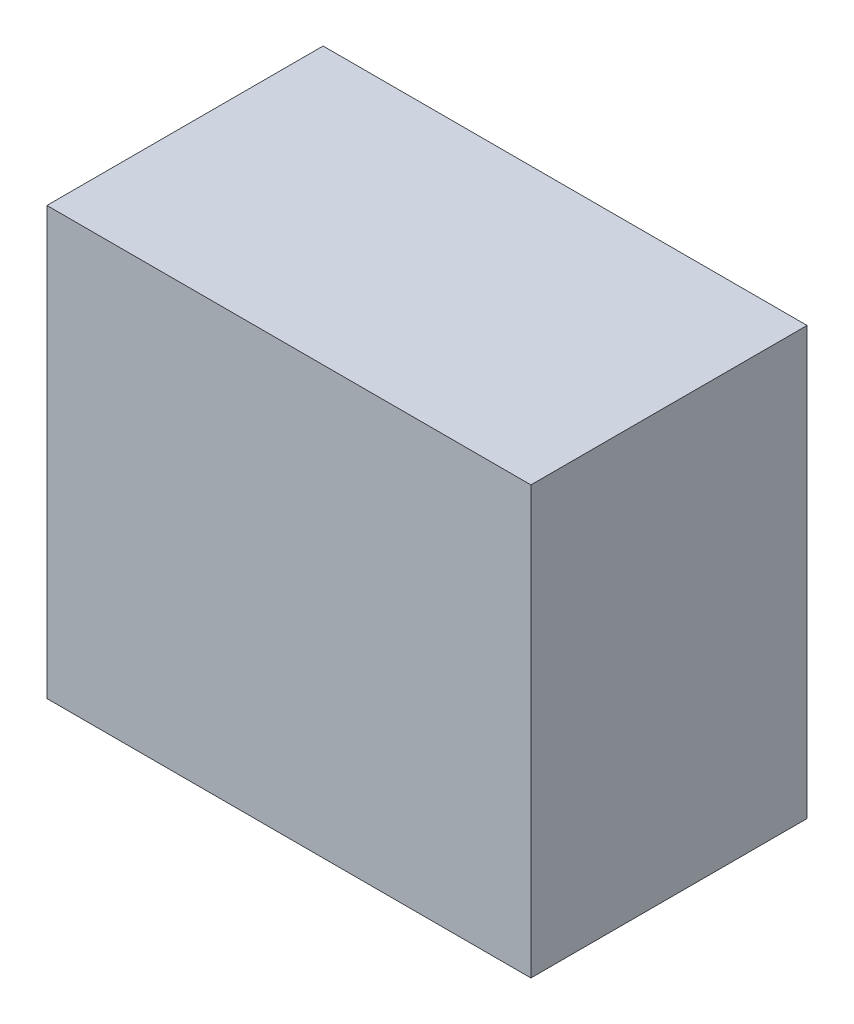
ISO-10303-21;
HEADER;
FILE_DESCRIPTION(('STEP AP214'),'2;1');
FILE_NAME('part.step','',(''),(''),'','','');
FILE_SCHEMA(('AUTOMOTIVE_DESIGN { 1 0 10303 214 1 1 1 1 }'));
ENDSEC;
DATA;
#1=APPLICATION_CONTEXT('core data for automotive mechanical design processes');
#2=APPLICATION_PROTOCOL_DEFINITION('international standard','automotive_design',2000,#1);
#3=PRODUCT_CONTEXT('',#1,'mechanical');
#4=PRODUCT('Part','Part','',(#3));
#5=PRODUCT_RELATED_PRODUCT_CATEGORY('part','',(#4));
#6=PRODUCT_DEFINITION_FORMATION('','',#4);
#7=PRODUCT_DEFINITION_CONTEXT('part definition',#1,'design');
#8=PRODUCT_DEFINITION('design','',#6,#7);
#9=PRODUCT_DEFINITION_SHAPE('','',#8);
#10=(LENGTH_UNIT() NAMED_UNIT(*) SI_UNIT(.MILLI.,.METRE.));
#11=(NAMED_UNIT(*) PLANE_ANGLE_UNIT() SI_UNIT($,.RADIAN.));
#12=(NAMED_UNIT(*) SI_UNIT($,.STERADIAN.) SOLID_ANGLE_UNIT());
#13=UNCERTAINTY_MEASURE_WITH_UNIT(LENGTH_MEASURE(1.E-05),#10,'distance_accuracy_value','');
#14=(GEOMETRIC_REPRESENTATION_CONTEXT(3) GLOBAL_UNCERTAINTY_ASSIGNED_CONTEXT((#13)) GLOBAL_UNIT_ASSIGNED_CONTEXT((#10,
#11,#12)) REPRESENTATION_CONTEXT('',''));
#15=CARTESIAN_POINT('',(0.,0.,0.));
#16=DIRECTION('',(0.,0.,1.));
#17=DIRECTION('',(1.,0.,0.));
#18=AXIS2_PLACEMENT_3D('',#15,#16,#17);
#19=CARTESIAN_POINT('',(-85.,150.,-48.5));
#20=DIRECTION('',(1.,0.,0.));
#21=DIRECTION('',(0.,0.,-1.));
#22=AXIS2_PLACEMENT_3D('',#19,#20,#21);
#23=PLANE('',#22);
#24=DIRECTION('',(0.,0.,1.));
#25=VECTOR('',#24,1.);
#26=CARTESIAN_POINT('',(-85.,0.,-48.5));
#27=LINE('',#26,#25);
#28=CARTESIAN_POINT('',(-85.,0.,-48.5));
#29=VERTEX_POINT('',#28);
#30=CARTESIAN_POINT('',(-85.,0.,48.5));
#31=VERTEX_POINT('',#30);
#32=EDGE_CURVE('E107',#29,#31,#27,.T.);
#33=ORIENTED_EDGE('',*,*,#32,.T.);
#34=DIRECTION('',(0.,-1.,0.));
#35=VECTOR('',#34,1.);
#36=CARTESIAN_POINT('',(-85.,150.,48.5));
#37=LINE('',#36,#35);
#38=CARTESIAN_POINT('',(-85.,150.,48.5));
#39=VERTEX_POINT('',#38);
#40=EDGE_CURVE('E11',#39,#31,#37,.T.);
#41=ORIENTED_EDGE('',*,*,#40,.F.);
#42=DIRECTION('',(0.,0.,1.));
#43=VECTOR('',#42,1.);
#44=CARTESIAN_POINT('',(-85.,150.,-48.5));
#45=LINE('',#44,#43);
#46=CARTESIAN_POINT('',(-85.,150.,-48.5));
#47=VERTEX_POINT('',#46);
#48=EDGE_CURVE('E91',#47,#39,#45,.T.);
#49=ORIENTED_EDGE('',*,*,#48,.F.);
#50=DIRECTION('',(0.,-1.,0.));
#51=VECTOR('',#50,1.);
#52=CARTESIAN_POINT('',(-85.,150.,-48.5));
#53=LINE('',#52,#51);
#54=EDGE_CURVE('E103',#47,#29,#53,.T.);
#55=ORIENTED_EDGE('',*,*,#54,.T.);
#56=EDGE_LOOP('',(#33,#41,#49,#55));
#57=FACE_BOUND('',#56,.T.);
#58=ADVANCED_FACE('F39',(#57),#23,.F.);
#59=CARTESIAN_POINT('',(-85.,150.,48.5));
#60=DIRECTION('',(0.,0.,-1.));
#61=DIRECTION('',(-1.,0.,0.));
#62=AXIS2_PLACEMENT_3D('',#59,#60,#61);
#63=PLANE('',#62);
#64=DIRECTION('',(1.,0.,0.));
#65=VECTOR('',#64,1.);
#66=CARTESIAN_POINT('',(-85.,0.,48.5));
#67=LINE('',#66,#65);
#68=CARTESIAN_POINT('',(85.,0.,48.5));
#69=VERTEX_POINT('',#68);
#70=EDGE_CURVE('E96',#31,#69,#67,.T.);
#71=ORIENTED_EDGE('',*,*,#70,.T.);
#72=DIRECTION('',(0.,-1.,0.));
#73=VECTOR('',#72,1.);
#74=CARTESIAN_POINT('',(85.,150.,48.5));
#75=LINE('',#74,#73);
#76=CARTESIAN_POINT('',(85.,150.,48.5));
#77=VERTEX_POINT('',#76);
#78=EDGE_CURVE('E48',#77,#69,#75,.T.);
#79=ORIENTED_EDGE('',*,*,#78,.F.);
#80=DIRECTION('',(1.,0.,0.));
#81=VECTOR('',#80,1.);
#82=CARTESIAN_POINT('',(-85.,150.,48.5));
#83=LINE('',#82,#81);
#84=EDGE_CURVE('E86',#39,#77,#83,.T.);
#85=ORIENTED_EDGE('',*,*,#84,.F.);
#86=ORIENTED_EDGE('',*,*,#40,.T.);
#87=EDGE_LOOP('',(#71,#79,#85,#86));
#88=FACE_BOUND('',#87,.T.);
#89=ADVANCED_FACE('F95',(#88),#63,.F.);
#90=CARTESIAN_POINT('',(85.,150.,-48.5));
#91=DIRECTION('',(-1.,0.,0.));
#92=DIRECTION('',(0.,0.,1.));
#93=AXIS2_PLACEMENT_3D('',#90,#91,#92);
#94=PLANE('',#93);
#95=DIRECTION('',(0.,0.,-1.));
#96=VECTOR('',#95,1.);
#97=CARTESIAN_POINT('',(85.,0.,-48.5));
#98=LINE('',#97,#96);
#99=CARTESIAN_POINT('',(85.,0.,-48.5));
#100=VERTEX_POINT('',#99);
#101=EDGE_CURVE('E73',#69,#100,#98,.T.);
#102=ORIENTED_EDGE('',*,*,#101,.T.);
#103=DIRECTION('',(0.,-1.,0.));
#104=VECTOR('',#103,1.);
#105=CARTESIAN_POINT('',(85.,150.,-48.5));
#106=LINE('',#105,#104);
#107=CARTESIAN_POINT('',(85.,150.,-48.5));
#108=VERTEX_POINT('',#107);
#109=EDGE_CURVE('E98',#108,#100,#106,.T.);
#110=ORIENTED_EDGE('',*,*,#109,.F.);
#111=DIRECTION('',(0.,0.,-1.));
#112=VECTOR('',#111,1.);
#113=CARTESIAN_POINT('',(85.,150.,-48.5));
#114=LINE('',#113,#112);
#115=EDGE_CURVE('E89',#77,#108,#114,.T.);
#116=ORIENTED_EDGE('',*,*,#115,.F.);
#117=ORIENTED_EDGE('',*,*,#78,.T.);
#118=EDGE_LOOP('',(#102,#110,#116,#117));
#119=FACE_BOUND('',#118,.T.);
#120=ADVANCED_FACE('F99',(#119),#94,.F.);
#121=CARTESIAN_POINT('',(-85.,150.,-48.5));
#122=DIRECTION('',(0.,0.,1.));
#123=DIRECTION('',(1.,0.,0.));
#124=AXIS2_PLACEMENT_3D('',#121,#122,#123);
#125=PLANE('',#124);
#126=DIRECTION('',(-1.,0.,0.));
#127=VECTOR('',#126,1.);
#128=CARTESIAN_POINT('',(-85.,0.,-48.5));
#129=LINE('',#128,#127);
#130=EDGE_CURVE('E79',#100,#29,#129,.T.);
#131=ORIENTED_EDGE('',*,*,#130,.T.);
#132=ORIENTED_EDGE('',*,*,#54,.F.);
#133=DIRECTION('',(-1.,0.,0.));
#134=VECTOR('',#133,1.);
#135=CARTESIAN_POINT('',(-85.,150.,-48.5));
#136=LINE('',#135,#134);
#137=EDGE_CURVE('E56',#108,#47,#136,.T.);
#138=ORIENTED_EDGE('',*,*,#137,.F.);
#139=ORIENTED_EDGE('',*,*,#109,.T.);
#140=EDGE_LOOP('',(#131,#132,#138,#139));
#141=FACE_BOUND('',#140,.T.);
#142=ADVANCED_FACE('F120',(#141),#125,.F.);
#143=CARTESIAN_POINT('',(0.,150.,0.));
#144=DIRECTION('',(0.,1.,0.));
#145=DIRECTION('',(0.,0.,1.));
#146=AXIS2_PLACEMENT_3D('',#143,#144,#145);
#147=PLANE('',#146);
#148=ORIENTED_EDGE('',*,*,#48,.T.);
#149=ORIENTED_EDGE('',*,*,#84,.T.);
#150=ORIENTED_EDGE('',*,*,#115,.T.);
#151=ORIENTED_EDGE('',*,*,#137,.T.);
#152=EDGE_LOOP('',(#148,#149,#150,#151));
#153=FACE_BOUND('',#152,.T.);
#154=ADVANCED_FACE('F87',(#153),#147,.T.);
#155=CARTESIAN_POINT('',(0.,0.,0.));
#156=DIRECTION('',(0.,1.,0.));
#157=DIRECTION('',(0.,0.,1.));
#158=AXIS2_PLACEMENT_3D('',#155,#156,#157);
#159=PLANE('',#158);
#160=ORIENTED_EDGE('',*,*,#32,.F.);
#161=ORIENTED_EDGE('',*,*,#130,.F.);
#162=ORIENTED_EDGE('',*,*,#101,.F.);
#163=ORIENTED_EDGE('',*,*,#70,.F.);
#164=EDGE_LOOP('',(#160,#161,#162,#163));
#165=FACE_BOUND('',#164,.T.);
#166=ADVANCED_FACE('F123',(#165),#159,.F.);
#167=CLOSED_SHELL('',(#58,#89,#120,#142,#154,#166));
#168=MANIFOLD_SOLID_BREP('B2',#167);
#169=ADVANCED_BREP_SHAPE_REPRESENTATION('',(#18,#168),#14);
#170=SHAPE_DEFINITION_REPRESENTATION(#9,#169);
ENDSEC;
END-ISO-10303-21;
